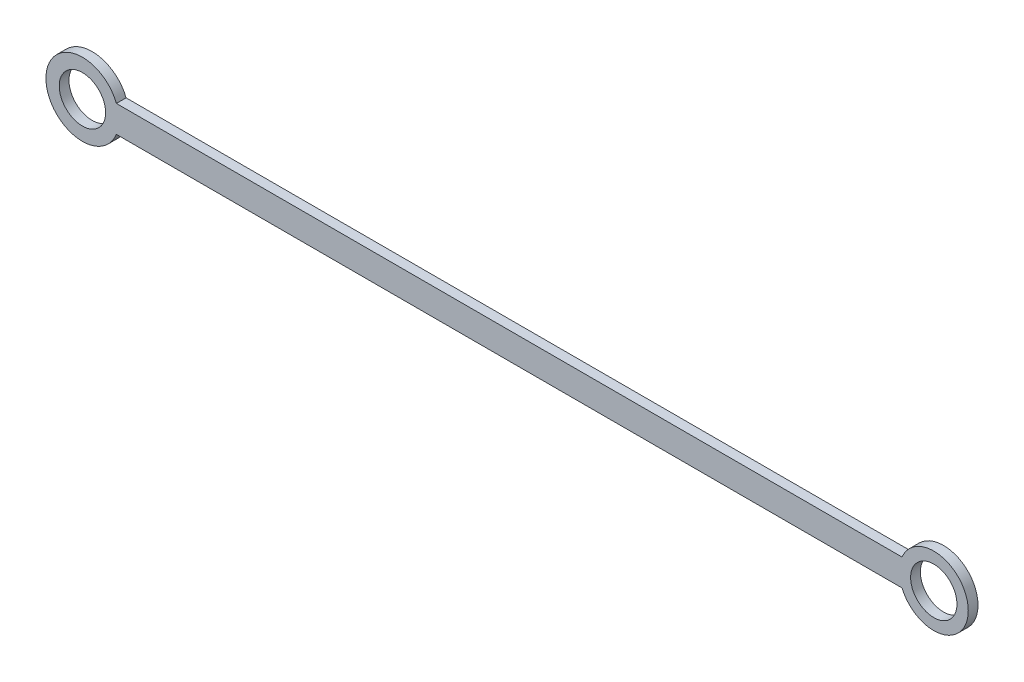
ISO-10303-21;
HEADER;
FILE_DESCRIPTION(('STEP AP214'),'2;1');
FILE_NAME('part.step','',(''),(''),'','','');
FILE_SCHEMA(('AUTOMOTIVE_DESIGN { 1 0 10303 214 1 1 1 1 }'));
ENDSEC;
DATA;
#1=APPLICATION_CONTEXT('core data for automotive mechanical design processes');
#2=APPLICATION_PROTOCOL_DEFINITION('international standard','automotive_design',2000,#1);
#3=PRODUCT_CONTEXT('',#1,'mechanical');
#4=PRODUCT('Part','Part','',(#3));
#5=PRODUCT_RELATED_PRODUCT_CATEGORY('part','',(#4));
#6=PRODUCT_DEFINITION_FORMATION('','',#4);
#7=PRODUCT_DEFINITION_CONTEXT('part definition',#1,'design');
#8=PRODUCT_DEFINITION('design','',#6,#7);
#9=PRODUCT_DEFINITION_SHAPE('','',#8);
#10=(LENGTH_UNIT() NAMED_UNIT(*) SI_UNIT(.MILLI.,.METRE.));
#11=(NAMED_UNIT(*) PLANE_ANGLE_UNIT() SI_UNIT($,.RADIAN.));
#12=(NAMED_UNIT(*) SI_UNIT($,.STERADIAN.) SOLID_ANGLE_UNIT());
#13=UNCERTAINTY_MEASURE_WITH_UNIT(LENGTH_MEASURE(1.E-05),#10,'distance_accuracy_value','');
#14=(GEOMETRIC_REPRESENTATION_CONTEXT(3) GLOBAL_UNCERTAINTY_ASSIGNED_CONTEXT((#13)) GLOBAL_UNIT_ASSIGNED_CONTEXT((#10,
#11,#12)) REPRESENTATION_CONTEXT('',''));
#15=CARTESIAN_POINT('',(0.,0.,0.));
#16=DIRECTION('',(0.,0.,1.));
#17=DIRECTION('',(1.,0.,0.));
#18=AXIS2_PLACEMENT_3D('',#15,#16,#17);
#19=CARTESIAN_POINT('',(0.,0.,4.));
#20=DIRECTION('',(0.,0.,1.));
#21=DIRECTION('',(1.,0.,0.));
#22=AXIS2_PLACEMENT_3D('',#19,#20,#21);
#23=PLANE('',#22);
#24=CARTESIAN_POINT('',(0.,0.,4.));
#25=DIRECTION('',(0.,0.,1.));
#26=DIRECTION('',(1.,0.,0.));
#27=AXIS2_PLACEMENT_3D('',#24,#25,#26);
#28=CIRCLE('',#27,9.53);
#29=CARTESIAN_POINT('',(9.53000000000001,0.,4.));
#30=VERTEX_POINT('',#29);
#31=EDGE_CURVE('E112',#30,#30,#28,.T.);
#32=ORIENTED_EDGE('',*,*,#31,.F.);
#33=EDGE_LOOP('',(#32));
#34=FACE_BOUND('',#33,.T.);
#35=CARTESIAN_POINT('',(0.,0.,4.));
#36=DIRECTION('',(0.,0.,1.));
#37=DIRECTION('',(1.,0.,0.));
#38=AXIS2_PLACEMENT_3D('',#35,#36,#37);
#39=CIRCLE('',#38,15.);
#40=CARTESIAN_POINT('',(13.9552857369529,5.5,4.));
#41=VERTEX_POINT('',#40);
#42=CARTESIAN_POINT('',(13.9552857369529,-5.5,4.));
#43=VERTEX_POINT('',#42);
#44=EDGE_CURVE('E92',#41,#43,#39,.T.);
#45=ORIENTED_EDGE('',*,*,#44,.T.);
#46=DIRECTION('',(1.,0.,0.));
#47=VECTOR('',#46,1.);
#48=CARTESIAN_POINT('',(13.9552857369529,-5.5,4.));
#49=LINE('',#48,#47);
#50=CARTESIAN_POINT('',(336.93551965233,-5.5,4.));
#51=VERTEX_POINT('',#50);
#52=EDGE_CURVE('E87',#43,#51,#49,.T.);
#53=ORIENTED_EDGE('',*,*,#52,.T.);
#54=CARTESIAN_POINT('',(350.,0.,4.));
#55=DIRECTION('',(0.,0.,1.));
#56=DIRECTION('',(1.,0.,0.));
#57=AXIS2_PLACEMENT_3D('',#54,#55,#56);
#58=CIRCLE('',#57,14.1750007673601);
#59=CARTESIAN_POINT('',(336.93551965233,5.5,4.));
#60=VERTEX_POINT('',#59);
#61=EDGE_CURVE('E90',#51,#60,#58,.T.);
#62=ORIENTED_EDGE('',*,*,#61,.T.);
#63=DIRECTION('',(-1.,0.,0.));
#64=VECTOR('',#63,1.);
#65=CARTESIAN_POINT('',(13.9552857369529,5.5,4.));
#66=LINE('',#65,#64);
#67=EDGE_CURVE('E57',#60,#41,#66,.T.);
#68=ORIENTED_EDGE('',*,*,#67,.T.);
#69=EDGE_LOOP('',(#45,#53,#62,#68));
#70=FACE_BOUND('',#69,.T.);
#71=CARTESIAN_POINT('',(350.,0.,4.));
#72=DIRECTION('',(0.,0.,1.));
#73=DIRECTION('',(-1.,0.,0.));
#74=AXIS2_PLACEMENT_3D('',#71,#72,#73);
#75=CIRCLE('',#74,9.53000000000001);
#76=CARTESIAN_POINT('',(340.47,0.,4.));
#77=VERTEX_POINT('',#76);
#78=EDGE_CURVE('E134',#77,#77,#75,.T.);
#79=ORIENTED_EDGE('',*,*,#78,.F.);
#80=EDGE_LOOP('',(#79));
#81=FACE_BOUND('',#80,.T.);
#82=ADVANCED_FACE('F39',(#34,#70,#81),#23,.T.);
#83=CARTESIAN_POINT('',(0.,0.,0.));
#84=DIRECTION('',(0.,0.,1.));
#85=DIRECTION('',(1.,0.,0.));
#86=AXIS2_PLACEMENT_3D('',#83,#84,#85);
#87=PLANE('',#86);
#88=CARTESIAN_POINT('',(0.,0.,0.));
#89=DIRECTION('',(0.,0.,1.));
#90=DIRECTION('',(1.,0.,0.));
#91=AXIS2_PLACEMENT_3D('',#88,#89,#90);
#92=CIRCLE('',#91,15.);
#93=CARTESIAN_POINT('',(13.9552857369529,5.5,0.));
#94=VERTEX_POINT('',#93);
#95=CARTESIAN_POINT('',(13.9552857369529,-5.5,0.));
#96=VERTEX_POINT('',#95);
#97=EDGE_CURVE('E108',#94,#96,#92,.T.);
#98=ORIENTED_EDGE('',*,*,#97,.F.);
#99=DIRECTION('',(-1.,0.,0.));
#100=VECTOR('',#99,1.);
#101=CARTESIAN_POINT('',(13.9552857369529,5.5,0.));
#102=LINE('',#101,#100);
#103=CARTESIAN_POINT('',(336.93551965233,5.5,0.));
#104=VERTEX_POINT('',#103);
#105=EDGE_CURVE('E80',#104,#94,#102,.T.);
#106=ORIENTED_EDGE('',*,*,#105,.F.);
#107=CARTESIAN_POINT('',(350.,0.,0.));
#108=DIRECTION('',(0.,0.,1.));
#109=DIRECTION('',(1.,0.,0.));
#110=AXIS2_PLACEMENT_3D('',#107,#108,#109);
#111=CIRCLE('',#110,14.1750007673601);
#112=CARTESIAN_POINT('',(336.93551965233,-5.5,0.));
#113=VERTEX_POINT('',#112);
#114=EDGE_CURVE('E74',#113,#104,#111,.T.);
#115=ORIENTED_EDGE('',*,*,#114,.F.);
#116=DIRECTION('',(1.,0.,0.));
#117=VECTOR('',#116,1.);
#118=CARTESIAN_POINT('',(13.9552857369529,-5.5,0.));
#119=LINE('',#118,#117);
#120=EDGE_CURVE('E97',#96,#113,#119,.T.);
#121=ORIENTED_EDGE('',*,*,#120,.F.);
#122=EDGE_LOOP('',(#98,#106,#115,#121));
#123=FACE_BOUND('',#122,.T.);
#124=CARTESIAN_POINT('',(0.,0.,0.));
#125=DIRECTION('',(0.,0.,1.));
#126=DIRECTION('',(1.,0.,0.));
#127=AXIS2_PLACEMENT_3D('',#124,#125,#126);
#128=CIRCLE('',#127,9.53);
#129=CARTESIAN_POINT('',(9.53000000000001,0.,0.));
#130=VERTEX_POINT('',#129);
#131=EDGE_CURVE('E130',#130,#130,#128,.T.);
#132=ORIENTED_EDGE('',*,*,#131,.T.);
#133=EDGE_LOOP('',(#132));
#134=FACE_BOUND('',#133,.T.);
#135=CARTESIAN_POINT('',(350.,0.,0.));
#136=DIRECTION('',(0.,0.,1.));
#137=DIRECTION('',(-1.,0.,0.));
#138=AXIS2_PLACEMENT_3D('',#135,#136,#137);
#139=CIRCLE('',#138,9.53000000000001);
#140=CARTESIAN_POINT('',(340.47,0.,0.));
#141=VERTEX_POINT('',#140);
#142=EDGE_CURVE('E138',#141,#141,#139,.T.);
#143=ORIENTED_EDGE('',*,*,#142,.T.);
#144=EDGE_LOOP('',(#143));
#145=FACE_BOUND('',#144,.T.);
#146=ADVANCED_FACE('F125',(#123,#134,#145),#87,.F.);
#147=CARTESIAN_POINT('',(0.,0.,4.));
#148=DIRECTION('',(0.,0.,-1.));
#149=DIRECTION('',(-1.,0.,0.));
#150=AXIS2_PLACEMENT_3D('',#147,#148,#149);
#151=CYLINDRICAL_SURFACE('',#150,15.);
#152=ORIENTED_EDGE('',*,*,#97,.T.);
#153=DIRECTION('',(0.,0.,-1.));
#154=VECTOR('',#153,1.);
#155=CARTESIAN_POINT('',(13.9552857369529,-5.5,4.));
#156=LINE('',#155,#154);
#157=EDGE_CURVE('E11',#43,#96,#156,.T.);
#158=ORIENTED_EDGE('',*,*,#157,.F.);
#159=ORIENTED_EDGE('',*,*,#44,.F.);
#160=DIRECTION('',(0.,0.,-1.));
#161=VECTOR('',#160,1.);
#162=CARTESIAN_POINT('',(13.9552857369529,5.5,4.));
#163=LINE('',#162,#161);
#164=EDGE_CURVE('E104',#41,#94,#163,.T.);
#165=ORIENTED_EDGE('',*,*,#164,.T.);
#166=EDGE_LOOP('',(#152,#158,#159,#165));
#167=FACE_BOUND('',#166,.T.);
#168=ADVANCED_FACE('F41',(#167),#151,.T.);
#169=CARTESIAN_POINT('',(13.9552857369529,-5.5,4.));
#170=DIRECTION('',(0.,1.,0.));
#171=DIRECTION('',(0.,0.,1.));
#172=AXIS2_PLACEMENT_3D('',#169,#170,#171);
#173=PLANE('',#172);
#174=ORIENTED_EDGE('',*,*,#120,.T.);
#175=DIRECTION('',(0.,0.,-1.));
#176=VECTOR('',#175,1.);
#177=CARTESIAN_POINT('',(336.93551965233,-5.5,4.));
#178=LINE('',#177,#176);
#179=EDGE_CURVE('E49',#51,#113,#178,.T.);
#180=ORIENTED_EDGE('',*,*,#179,.F.);
#181=ORIENTED_EDGE('',*,*,#52,.F.);
#182=ORIENTED_EDGE('',*,*,#157,.T.);
#183=EDGE_LOOP('',(#174,#180,#181,#182));
#184=FACE_BOUND('',#183,.T.);
#185=ADVANCED_FACE('F96',(#184),#173,.F.);
#186=CARTESIAN_POINT('',(350.,0.,4.));
#187=DIRECTION('',(0.,0.,-1.));
#188=DIRECTION('',(-1.,0.,0.));
#189=AXIS2_PLACEMENT_3D('',#186,#187,#188);
#190=CYLINDRICAL_SURFACE('',#189,14.1750007673601);
#191=ORIENTED_EDGE('',*,*,#114,.T.);
#192=DIRECTION('',(0.,0.,-1.));
#193=VECTOR('',#192,1.);
#194=CARTESIAN_POINT('',(336.93551965233,5.5,4.));
#195=LINE('',#194,#193);
#196=EDGE_CURVE('E99',#60,#104,#195,.T.);
#197=ORIENTED_EDGE('',*,*,#196,.F.);
#198=ORIENTED_EDGE('',*,*,#61,.F.);
#199=ORIENTED_EDGE('',*,*,#179,.T.);
#200=EDGE_LOOP('',(#191,#197,#198,#199));
#201=FACE_BOUND('',#200,.T.);
#202=ADVANCED_FACE('F100',(#201),#190,.T.);
#203=CARTESIAN_POINT('',(13.9552857369529,5.5,4.));
#204=DIRECTION('',(0.,-1.,0.));
#205=DIRECTION('',(0.,0.,-1.));
#206=AXIS2_PLACEMENT_3D('',#203,#204,#205);
#207=PLANE('',#206);
#208=ORIENTED_EDGE('',*,*,#105,.T.);
#209=ORIENTED_EDGE('',*,*,#164,.F.);
#210=ORIENTED_EDGE('',*,*,#67,.F.);
#211=ORIENTED_EDGE('',*,*,#196,.T.);
#212=EDGE_LOOP('',(#208,#209,#210,#211));
#213=FACE_BOUND('',#212,.T.);
#214=ADVANCED_FACE('F122',(#213),#207,.F.);
#215=CARTESIAN_POINT('',(0.,0.,4.));
#216=DIRECTION('',(0.,0.,-1.));
#217=DIRECTION('',(-1.,0.,0.));
#218=AXIS2_PLACEMENT_3D('',#215,#216,#217);
#219=CYLINDRICAL_SURFACE('',#218,9.53);
#220=ORIENTED_EDGE('',*,*,#31,.T.);
#221=EDGE_LOOP('',(#220));
#222=FACE_BOUND('',#221,.T.);
#223=ORIENTED_EDGE('',*,*,#131,.F.);
#224=EDGE_LOOP('',(#223));
#225=FACE_BOUND('',#224,.T.);
#226=ADVANCED_FACE('F157',(#222,#225),#219,.F.);
#227=CARTESIAN_POINT('',(350.,0.,4.));
#228=DIRECTION('',(0.,0.,-1.));
#229=DIRECTION('',(-1.,0.,0.));
#230=AXIS2_PLACEMENT_3D('',#227,#228,#229);
#231=CYLINDRICAL_SURFACE('',#230,9.53000000000001);
#232=ORIENTED_EDGE('',*,*,#78,.T.);
#233=EDGE_LOOP('',(#232));
#234=FACE_BOUND('',#233,.T.);
#235=ORIENTED_EDGE('',*,*,#142,.F.);
#236=EDGE_LOOP('',(#235));
#237=FACE_BOUND('',#236,.T.);
#238=ADVANCED_FACE('F146',(#234,#237),#231,.F.);
#239=CLOSED_SHELL('',(#82,#146,#168,#185,#202,#214,#226,#238));
#240=MANIFOLD_SOLID_BREP('B2',#239);
#241=ADVANCED_BREP_SHAPE_REPRESENTATION('',(#18,#240),#14);
#242=SHAPE_DEFINITION_REPRESENTATION(#9,#241);
ENDSEC;
END-ISO-10303-21;
